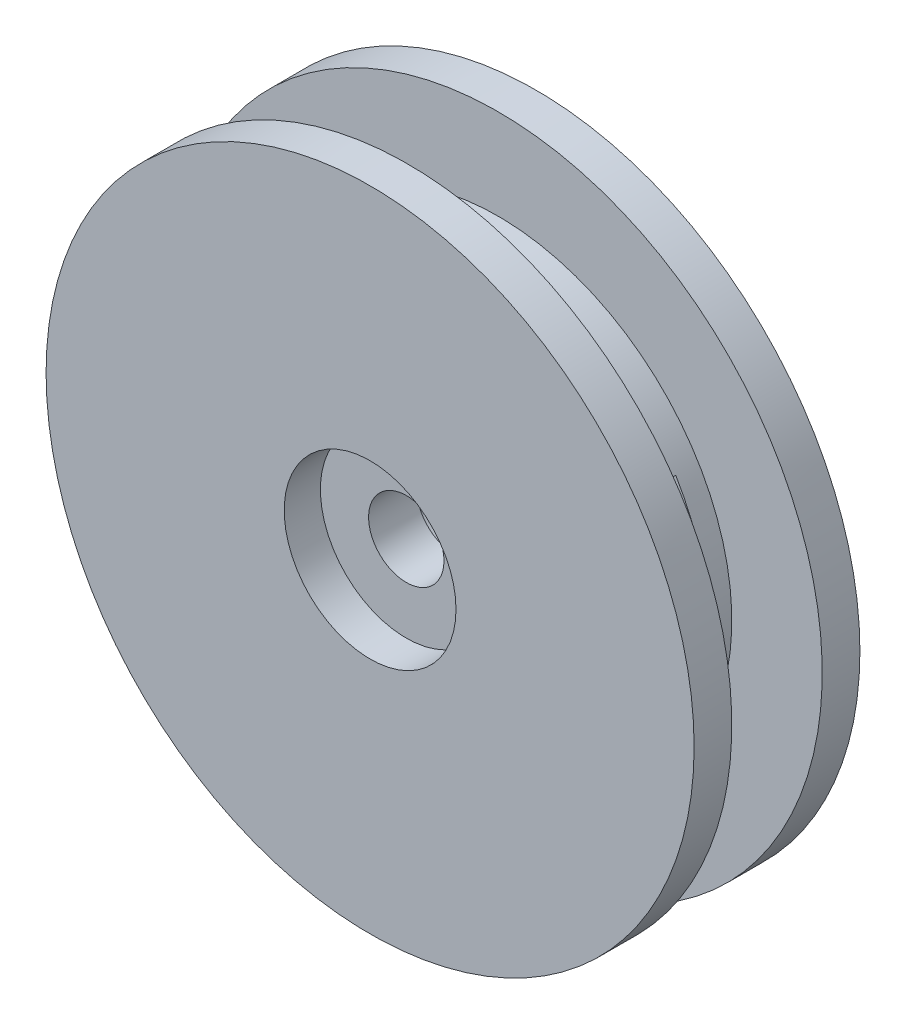
ISO-10303-21;
HEADER;
FILE_DESCRIPTION(('STEP AP214'),'2;1');
FILE_NAME('part.step','',(''),(''),'','','');
FILE_SCHEMA(('AUTOMOTIVE_DESIGN { 1 0 10303 214 1 1 1 1 }'));
ENDSEC;
DATA;
#1=APPLICATION_CONTEXT('core data for automotive mechanical design processes');
#2=APPLICATION_PROTOCOL_DEFINITION('international standard','automotive_design',2000,#1);
#3=PRODUCT_CONTEXT('',#1,'mechanical');
#4=PRODUCT('Part','Part','',(#3));
#5=PRODUCT_RELATED_PRODUCT_CATEGORY('part','',(#4));
#6=PRODUCT_DEFINITION_FORMATION('','',#4);
#7=PRODUCT_DEFINITION_CONTEXT('part definition',#1,'design');
#8=PRODUCT_DEFINITION('design','',#6,#7);
#9=PRODUCT_DEFINITION_SHAPE('','',#8);
#10=(LENGTH_UNIT() NAMED_UNIT(*) SI_UNIT(.MILLI.,.METRE.));
#11=(NAMED_UNIT(*) PLANE_ANGLE_UNIT() SI_UNIT($,.RADIAN.));
#12=(NAMED_UNIT(*) SI_UNIT($,.STERADIAN.) SOLID_ANGLE_UNIT());
#13=UNCERTAINTY_MEASURE_WITH_UNIT(LENGTH_MEASURE(1.E-05),#10,'distance_accuracy_value','');
#14=(GEOMETRIC_REPRESENTATION_CONTEXT(3) GLOBAL_UNCERTAINTY_ASSIGNED_CONTEXT((#13)) GLOBAL_UNIT_ASSIGNED_CONTEXT((#10,
#11,#12)) REPRESENTATION_CONTEXT('',''));
#15=CARTESIAN_POINT('',(0.,0.,0.));
#16=DIRECTION('',(0.,0.,1.));
#17=DIRECTION('',(1.,0.,0.));
#18=AXIS2_PLACEMENT_3D('',#15,#16,#17);
#19=CARTESIAN_POINT('',(0.,0.,0.));
#20=DIRECTION('',(0.,0.,1.));
#21=DIRECTION('',(1.,0.,0.));
#22=AXIS2_PLACEMENT_3D('',#19,#20,#21);
#23=CYLINDRICAL_SURFACE('',#22,1.25);
#24=CARTESIAN_POINT('',(0.,0.,4.3));
#25=DIRECTION('',(0.,0.,1.));
#26=DIRECTION('',(1.,0.,0.));
#27=AXIS2_PLACEMENT_3D('',#24,#25,#26);
#28=CIRCLE('',#27,1.25);
#29=CARTESIAN_POINT('',(1.25,0.,4.3));
#30=VERTEX_POINT('',#29);
#31=EDGE_CURVE('E108',#30,#30,#28,.T.);
#32=ORIENTED_EDGE('',*,*,#31,.T.);
#33=EDGE_LOOP('',(#32));
#34=FACE_BOUND('',#33,.T.);
#35=CARTESIAN_POINT('',(0.,0.,2.7));
#36=DIRECTION('',(0.,0.,-1.));
#37=DIRECTION('',(-1.,0.,0.));
#38=AXIS2_PLACEMENT_3D('',#35,#36,#37);
#39=CIRCLE('',#38,1.25);
#40=CARTESIAN_POINT('',(-1.25,0.,2.7));
#41=VERTEX_POINT('',#40);
#42=EDGE_CURVE('E105',#41,#41,#39,.F.);
#43=ORIENTED_EDGE('',*,*,#42,.F.);
#44=EDGE_LOOP('',(#43));
#45=FACE_BOUND('',#44,.T.);
#46=ADVANCED_FACE('F36',(#34,#45),#23,.F.);
#47=CARTESIAN_POINT('',(0.,0.,5.5));
#48=DIRECTION('',(0.,0.,-1.));
#49=DIRECTION('',(-1.,0.,0.));
#50=AXIS2_PLACEMENT_3D('',#47,#48,#49);
#51=CYLINDRICAL_SURFACE('',#50,10.75);
#52=CARTESIAN_POINT('',(0.,0.,4.25));
#53=DIRECTION('',(0.,0.,-1.));
#54=DIRECTION('',(-1.,0.,0.));
#55=AXIS2_PLACEMENT_3D('',#52,#53,#54);
#56=CIRCLE('',#55,10.75);
#57=CARTESIAN_POINT('',(-10.75,0.,4.25));
#58=VERTEX_POINT('',#57);
#59=EDGE_CURVE('E114',#58,#58,#56,.T.);
#60=ORIENTED_EDGE('',*,*,#59,.F.);
#61=EDGE_LOOP('',(#60));
#62=FACE_BOUND('',#61,.T.);
#63=CARTESIAN_POINT('',(0.,0.,5.5));
#64=DIRECTION('',(0.,0.,1.));
#65=DIRECTION('',(1.,0.,0.));
#66=AXIS2_PLACEMENT_3D('',#63,#64,#65);
#67=CIRCLE('',#66,10.75);
#68=CARTESIAN_POINT('',(10.75,0.,5.5));
#69=VERTEX_POINT('',#68);
#70=EDGE_CURVE('E99',#69,#69,#67,.T.);
#71=ORIENTED_EDGE('',*,*,#70,.F.);
#72=EDGE_LOOP('',(#71));
#73=FACE_BOUND('',#72,.T.);
#74=ADVANCED_FACE('F161',(#62,#73),#51,.T.);
#75=CARTESIAN_POINT('',(0.,0.,5.5));
#76=DIRECTION('',(0.,0.,1.));
#77=DIRECTION('',(1.,0.,0.));
#78=AXIS2_PLACEMENT_3D('',#75,#76,#77);
#79=PLANE('',#78);
#80=CARTESIAN_POINT('',(0.,0.,5.5));
#81=DIRECTION('',(0.,0.,1.));
#82=DIRECTION('',(1.,0.,0.));
#83=AXIS2_PLACEMENT_3D('',#80,#81,#82);
#84=CIRCLE('',#83,2.85);
#85=CARTESIAN_POINT('',(2.85,0.,5.5));
#86=VERTEX_POINT('',#85);
#87=EDGE_CURVE('E112',#86,#86,#84,.T.);
#88=ORIENTED_EDGE('',*,*,#87,.F.);
#89=EDGE_LOOP('',(#88));
#90=FACE_BOUND('',#89,.T.);
#91=ORIENTED_EDGE('',*,*,#70,.T.);
#92=EDGE_LOOP('',(#91));
#93=FACE_BOUND('',#92,.T.);
#94=ADVANCED_FACE('F157',(#90,#93),#79,.T.);
#95=CARTESIAN_POINT('',(0.,10.75,4.25));
#96=DIRECTION('',(0.,0.,1.));
#97=DIRECTION('',(1.,0.,0.));
#98=AXIS2_PLACEMENT_3D('',#95,#96,#97);
#99=PLANE('',#98);
#100=CARTESIAN_POINT('',(0.,0.,4.25));
#101=DIRECTION('',(0.,0.,-1.));
#102=DIRECTION('',(-1.,0.,0.));
#103=AXIS2_PLACEMENT_3D('',#100,#101,#102);
#104=CIRCLE('',#103,7.75);
#105=CARTESIAN_POINT('',(-7.75,0.,4.25));
#106=VERTEX_POINT('',#105);
#107=EDGE_CURVE('E118',#106,#106,#104,.T.);
#108=ORIENTED_EDGE('',*,*,#107,.F.);
#109=EDGE_LOOP('',(#108));
#110=FACE_BOUND('',#109,.T.);
#111=ORIENTED_EDGE('',*,*,#59,.T.);
#112=EDGE_LOOP('',(#111));
#113=FACE_BOUND('',#112,.T.);
#114=ADVANCED_FACE('F149',(#110,#113),#99,.F.);
#115=CARTESIAN_POINT('',(0.,0.,0.));
#116=DIRECTION('',(0.,0.,-1.));
#117=DIRECTION('',(-1.,0.,0.));
#118=AXIS2_PLACEMENT_3D('',#115,#116,#117);
#119=CYLINDRICAL_SURFACE('',#118,7.75);
#120=DIRECTION('',(0.,0.,-1.));
#121=VECTOR('',#120,1.);
#122=CARTESIAN_POINT('',(6.63795902367588,4.,0.));
#123=LINE('',#122,#121);
#124=CARTESIAN_POINT('',(6.63795902367588,4.,3.5));
#125=VERTEX_POINT('',#124);
#126=CARTESIAN_POINT('',(6.63795902367588,4.,2.));
#127=VERTEX_POINT('',#126);
#128=EDGE_CURVE('E76',#125,#127,#123,.T.);
#129=ORIENTED_EDGE('',*,*,#128,.T.);
#130=CARTESIAN_POINT('',(0.,0.,2.));
#131=DIRECTION('',(0.,0.,-1.));
#132=DIRECTION('',(0.,1.,0.));
#133=AXIS2_PLACEMENT_3D('',#130,#131,#132);
#134=CIRCLE('',#133,7.75);
#135=CARTESIAN_POINT('',(7.33570037556061,2.5,2.));
#136=VERTEX_POINT('',#135);
#137=EDGE_CURVE('E11',#127,#136,#134,.T.);
#138=ORIENTED_EDGE('',*,*,#137,.T.);
#139=DIRECTION('',(0.,0.,-1.));
#140=VECTOR('',#139,1.);
#141=CARTESIAN_POINT('',(7.33570037556061,2.5,0.));
#142=LINE('',#141,#140);
#143=CARTESIAN_POINT('',(7.33570037556061,2.5,3.5));
#144=VERTEX_POINT('',#143);
#145=EDGE_CURVE('E40',#136,#144,#142,.F.);
#146=ORIENTED_EDGE('',*,*,#145,.T.);
#147=CARTESIAN_POINT('',(0.,0.,3.5));
#148=DIRECTION('',(0.,0.,1.));
#149=DIRECTION('',(1.,0.,0.));
#150=AXIS2_PLACEMENT_3D('',#147,#148,#149);
#151=CIRCLE('',#150,7.75);
#152=EDGE_CURVE('E80',#144,#125,#151,.T.);
#153=ORIENTED_EDGE('',*,*,#152,.T.);
#154=EDGE_LOOP('',(#129,#138,#146,#153));
#155=FACE_BOUND('',#154,.T.);
#156=DIRECTION('',(0.,0.,-1.));
#157=VECTOR('',#156,1.);
#158=CARTESIAN_POINT('',(-7.33570037556061,2.5,0.));
#159=LINE('',#158,#157);
#160=CARTESIAN_POINT('',(-7.33570037556061,2.5,3.5));
#161=VERTEX_POINT('',#160);
#162=CARTESIAN_POINT('',(-7.33570037556061,2.5,2.));
#163=VERTEX_POINT('',#162);
#164=EDGE_CURVE('E96',#161,#163,#159,.T.);
#165=ORIENTED_EDGE('',*,*,#164,.T.);
#166=CARTESIAN_POINT('',(-6.63795902367588,4.,2.));
#167=VERTEX_POINT('',#166);
#168=EDGE_CURVE('E46',#163,#167,#134,.T.);
#169=ORIENTED_EDGE('',*,*,#168,.T.);
#170=DIRECTION('',(0.,0.,-1.));
#171=VECTOR('',#170,1.);
#172=CARTESIAN_POINT('',(-6.63795902367588,4.,0.));
#173=LINE('',#172,#171);
#174=CARTESIAN_POINT('',(-6.63795902367588,4.,3.5));
#175=VERTEX_POINT('',#174);
#176=EDGE_CURVE('E97',#167,#175,#173,.F.);
#177=ORIENTED_EDGE('',*,*,#176,.T.);
#178=EDGE_CURVE('E86',#175,#161,#151,.T.);
#179=ORIENTED_EDGE('',*,*,#178,.T.);
#180=EDGE_LOOP('',(#165,#169,#177,#179));
#181=FACE_BOUND('',#180,.T.);
#182=CARTESIAN_POINT('',(0.,0.,1.25));
#183=DIRECTION('',(0.,0.,-1.));
#184=DIRECTION('',(-1.,0.,0.));
#185=AXIS2_PLACEMENT_3D('',#182,#183,#184);
#186=CIRCLE('',#185,7.75);
#187=CARTESIAN_POINT('',(-7.75,0.,1.25));
#188=VERTEX_POINT('',#187);
#189=EDGE_CURVE('E121',#188,#188,#186,.T.);
#190=ORIENTED_EDGE('',*,*,#189,.F.);
#191=EDGE_LOOP('',(#190));
#192=FACE_BOUND('',#191,.T.);
#193=ORIENTED_EDGE('',*,*,#107,.T.);
#194=EDGE_LOOP('',(#193));
#195=FACE_BOUND('',#194,.T.);
#196=ADVANCED_FACE('F91',(#155,#181,#192,#195),#119,.T.);
#197=CARTESIAN_POINT('',(0.,7.75,1.25));
#198=DIRECTION('',(0.,0.,-1.));
#199=DIRECTION('',(-1.,0.,0.));
#200=AXIS2_PLACEMENT_3D('',#197,#198,#199);
#201=PLANE('',#200);
#202=CARTESIAN_POINT('',(0.,0.,1.25));
#203=DIRECTION('',(0.,0.,-1.));
#204=DIRECTION('',(-1.,0.,0.));
#205=AXIS2_PLACEMENT_3D('',#202,#203,#204);
#206=CIRCLE('',#205,10.75);
#207=CARTESIAN_POINT('',(-10.75,0.,1.25));
#208=VERTEX_POINT('',#207);
#209=EDGE_CURVE('E124',#208,#208,#206,.T.);
#210=ORIENTED_EDGE('',*,*,#209,.F.);
#211=EDGE_LOOP('',(#210));
#212=FACE_BOUND('',#211,.T.);
#213=ORIENTED_EDGE('',*,*,#189,.T.);
#214=EDGE_LOOP('',(#213));
#215=FACE_BOUND('',#214,.T.);
#216=ADVANCED_FACE('F148',(#212,#215),#201,.F.);
#217=CARTESIAN_POINT('',(0.,0.,0.));
#218=DIRECTION('',(0.,0.,1.));
#219=DIRECTION('',(1.,0.,0.));
#220=AXIS2_PLACEMENT_3D('',#217,#218,#219);
#221=PLANE('',#220);
#222=CARTESIAN_POINT('',(0.,0.,0.));
#223=DIRECTION('',(0.,0.,-1.));
#224=DIRECTION('',(-1.,0.,0.));
#225=AXIS2_PLACEMENT_3D('',#222,#223,#224);
#226=CIRCLE('',#225,2.32);
#227=CARTESIAN_POINT('',(-2.32,0.,0.));
#228=VERTEX_POINT('',#227);
#229=EDGE_CURVE('E132',#228,#228,#226,.T.);
#230=ORIENTED_EDGE('',*,*,#229,.F.);
#231=EDGE_LOOP('',(#230));
#232=FACE_BOUND('',#231,.T.);
#233=CARTESIAN_POINT('',(0.,0.,0.));
#234=DIRECTION('',(0.,0.,1.));
#235=DIRECTION('',(1.,0.,0.));
#236=AXIS2_PLACEMENT_3D('',#233,#234,#235);
#237=CIRCLE('',#236,10.75);
#238=CARTESIAN_POINT('',(10.75,0.,0.));
#239=VERTEX_POINT('',#238);
#240=EDGE_CURVE('E102',#239,#239,#237,.T.);
#241=ORIENTED_EDGE('',*,*,#240,.F.);
#242=EDGE_LOOP('',(#241));
#243=FACE_BOUND('',#242,.T.);
#244=ADVANCED_FACE('F192',(#232,#243),#221,.F.);
#245=ORIENTED_EDGE('',*,*,#209,.T.);
#246=EDGE_LOOP('',(#245));
#247=FACE_BOUND('',#246,.T.);
#248=ORIENTED_EDGE('',*,*,#240,.T.);
#249=EDGE_LOOP('',(#248));
#250=FACE_BOUND('',#249,.T.);
#251=ADVANCED_FACE('F38',(#247,#250),#51,.T.);
#252=CARTESIAN_POINT('',(0.,0.,4.3));
#253=DIRECTION('',(0.,0.,1.));
#254=DIRECTION('',(1.,0.,0.));
#255=AXIS2_PLACEMENT_3D('',#252,#253,#254);
#256=CYLINDRICAL_SURFACE('',#255,2.85);
#257=CARTESIAN_POINT('',(0.,0.,4.3));
#258=DIRECTION('',(0.,0.,1.));
#259=DIRECTION('',(1.,0.,0.));
#260=AXIS2_PLACEMENT_3D('',#257,#258,#259);
#261=CIRCLE('',#260,2.85);
#262=CARTESIAN_POINT('',(2.85,0.,4.3));
#263=VERTEX_POINT('',#262);
#264=EDGE_CURVE('E127',#263,#263,#261,.T.);
#265=ORIENTED_EDGE('',*,*,#264,.F.);
#266=EDGE_LOOP('',(#265));
#267=FACE_BOUND('',#266,.T.);
#268=ORIENTED_EDGE('',*,*,#87,.T.);
#269=EDGE_LOOP('',(#268));
#270=FACE_BOUND('',#269,.T.);
#271=ADVANCED_FACE('F186',(#267,#270),#256,.F.);
#272=CARTESIAN_POINT('',(0.,0.,4.3));
#273=DIRECTION('',(0.,0.,1.));
#274=DIRECTION('',(1.,0.,0.));
#275=AXIS2_PLACEMENT_3D('',#272,#273,#274);
#276=PLANE('',#275);
#277=ORIENTED_EDGE('',*,*,#31,.F.);
#278=EDGE_LOOP('',(#277));
#279=FACE_BOUND('',#278,.T.);
#280=ORIENTED_EDGE('',*,*,#264,.T.);
#281=EDGE_LOOP('',(#280));
#282=FACE_BOUND('',#281,.T.);
#283=ADVANCED_FACE('F182',(#279,#282),#276,.T.);
#284=CARTESIAN_POINT('',(0.,0.,2.7));
#285=DIRECTION('',(0.,0.,-1.));
#286=DIRECTION('',(-1.,0.,0.));
#287=AXIS2_PLACEMENT_3D('',#284,#285,#286);
#288=PLANE('',#287);
#289=CARTESIAN_POINT('',(0.,0.,2.7));
#290=DIRECTION('',(0.,0.,-1.));
#291=DIRECTION('',(-1.,0.,0.));
#292=AXIS2_PLACEMENT_3D('',#289,#290,#291);
#293=CIRCLE('',#292,2.32);
#294=CARTESIAN_POINT('',(-2.32,0.,2.7));
#295=VERTEX_POINT('',#294);
#296=EDGE_CURVE('E109',#295,#295,#293,.T.);
#297=ORIENTED_EDGE('',*,*,#296,.T.);
#298=EDGE_LOOP('',(#297));
#299=FACE_BOUND('',#298,.T.);
#300=ORIENTED_EDGE('',*,*,#42,.T.);
#301=EDGE_LOOP('',(#300));
#302=FACE_BOUND('',#301,.T.);
#303=ADVANCED_FACE('F185',(#299,#302),#288,.T.);
#304=CARTESIAN_POINT('',(0.,0.,2.7));
#305=DIRECTION('',(0.,0.,-1.));
#306=DIRECTION('',(-1.,0.,0.));
#307=AXIS2_PLACEMENT_3D('',#304,#305,#306);
#308=CYLINDRICAL_SURFACE('',#307,2.32);
#309=CARTESIAN_POINT('',(-2.32,0.,2.7));
#310=CARTESIAN_POINT('',(-2.32,0.,2.671875));
#311=CARTESIAN_POINT('',(-2.32,0.,2.64375));
#312=CARTESIAN_POINT('',(-2.32,0.,2.5875));
#313=CARTESIAN_POINT('',(-2.32,0.,2.559375));
#314=CARTESIAN_POINT('',(-2.32,0.,2.503125));
#315=CARTESIAN_POINT('',(-2.32,0.,2.475));
#316=CARTESIAN_POINT('',(-2.32,0.,2.41875));
#317=CARTESIAN_POINT('',(-2.32,0.,2.390625));
#318=CARTESIAN_POINT('',(-2.32,0.,2.334375));
#319=CARTESIAN_POINT('',(-2.32,0.,2.30625));
#320=CARTESIAN_POINT('',(-2.32,0.,2.25));
#321=CARTESIAN_POINT('',(-2.32,0.,2.221875));
#322=CARTESIAN_POINT('',(-2.32,0.,2.165625));
#323=CARTESIAN_POINT('',(-2.32,0.,2.1375));
#324=CARTESIAN_POINT('',(-2.32,0.,2.08125));
#325=CARTESIAN_POINT('',(-2.32,0.,2.053125));
#326=CARTESIAN_POINT('',(-2.32,0.,1.996875));
#327=CARTESIAN_POINT('',(-2.32,0.,1.96875));
#328=CARTESIAN_POINT('',(-2.32,0.,1.9125));
#329=CARTESIAN_POINT('',(-2.32,0.,1.884375));
#330=CARTESIAN_POINT('',(-2.32,0.,1.828125));
#331=CARTESIAN_POINT('',(-2.32,0.,1.8));
#332=CARTESIAN_POINT('',(-2.32,0.,1.74375));
#333=CARTESIAN_POINT('',(-2.32,0.,1.715625));
#334=CARTESIAN_POINT('',(-2.32,0.,1.659375));
#335=CARTESIAN_POINT('',(-2.32,0.,1.63125));
#336=CARTESIAN_POINT('',(-2.32,0.,1.575));
#337=CARTESIAN_POINT('',(-2.32,0.,1.546875));
#338=CARTESIAN_POINT('',(-2.32,0.,1.490625));
#339=CARTESIAN_POINT('',(-2.32,0.,1.4625));
#340=CARTESIAN_POINT('',(-2.32,0.,1.40625));
#341=CARTESIAN_POINT('',(-2.32,0.,1.378125));
#342=CARTESIAN_POINT('',(-2.32,0.,1.321875));
#343=CARTESIAN_POINT('',(-2.32,0.,1.29375));
#344=CARTESIAN_POINT('',(-2.32,0.,1.2375));
#345=CARTESIAN_POINT('',(-2.32,0.,1.209375));
#346=CARTESIAN_POINT('',(-2.32,0.,1.153125));
#347=CARTESIAN_POINT('',(-2.32,0.,1.125));
#348=CARTESIAN_POINT('',(-2.32,0.,1.06875));
#349=CARTESIAN_POINT('',(-2.32,0.,1.040625));
#350=CARTESIAN_POINT('',(-2.32,0.,0.984375));
#351=CARTESIAN_POINT('',(-2.32,0.,0.95625));
#352=CARTESIAN_POINT('',(-2.32,0.,0.9));
#353=CARTESIAN_POINT('',(-2.32,0.,0.871875));
#354=CARTESIAN_POINT('',(-2.32,0.,0.815625));
#355=CARTESIAN_POINT('',(-2.32,0.,0.7875));
#356=CARTESIAN_POINT('',(-2.32,0.,0.73125));
#357=CARTESIAN_POINT('',(-2.32,0.,0.703125000000001));
#358=CARTESIAN_POINT('',(-2.32,0.,0.646875000000001));
#359=CARTESIAN_POINT('',(-2.32,0.,0.61875));
#360=CARTESIAN_POINT('',(-2.32,0.,0.5625));
#361=CARTESIAN_POINT('',(-2.32,0.,0.534375000000001));
#362=CARTESIAN_POINT('',(-2.32,0.,0.478125000000001));
#363=CARTESIAN_POINT('',(-2.32,0.,0.45));
#364=CARTESIAN_POINT('',(-2.32,0.,0.39375));
#365=CARTESIAN_POINT('',(-2.32,0.,0.365625));
#366=CARTESIAN_POINT('',(-2.32,0.,0.309375));
#367=CARTESIAN_POINT('',(-2.32,0.,0.28125));
#368=CARTESIAN_POINT('',(-2.32,0.,0.225));
#369=CARTESIAN_POINT('',(-2.32,0.,0.196875));
#370=CARTESIAN_POINT('',(-2.32,0.,0.140625));
#371=CARTESIAN_POINT('',(-2.32,0.,0.1125));
#372=CARTESIAN_POINT('',(-2.32,0.,0.0562500000000003));
#373=CARTESIAN_POINT('',(-2.32,0.,0.0281250000000003));
#374=CARTESIAN_POINT('',(-2.32,0.,0.));
#375=B_SPLINE_CURVE_WITH_KNOTS('',3,(#309,#310,#311,#312,#313,#314,#315,#316,#317,#318,#319,
#320,#321,#322,#323,#324,#325,#326,#327,#328,#329,#330,#331,#332,#333,#334,#335,#336,#337,#338,
#339,#340,#341,#342,#343,#344,#345,#346,#347,#348,#349,#350,#351,#352,#353,#354,#355,#356,#357,
#358,#359,#360,#361,#362,#363,#364,#365,#366,#367,#368,#369,#370,#371,#372,#373,#374),
.UNSPECIFIED.,.F.,.F.,(4,2,2,2,2,2,2,2,2,2,2,2,2,2,2,2,2,2,2,2,2,2,2,2,2,2,2,2,2,2,2,2,4),(0.,
0.0843750000000003,0.16875,0.253125,0.3375,0.421875,0.50625,0.590625,0.675,0.759375,0.84375,
0.928125,1.0125,1.096875,1.18125,1.265625,1.35,1.434375,1.51875,1.603125,1.6875,1.771875,
1.85625,1.940625,2.025,2.109375,2.19375,2.278125,2.3625,2.446875,2.53125,2.615625,2.7),.UNSPECIFIED.);
#376=EDGE_CURVE('BSEAM180',#295,#228,#375,.T.);
#377=ORIENTED_EDGE('',*,*,#296,.F.);
#378=ORIENTED_EDGE('',*,*,#229,.T.);
#379=ORIENTED_EDGE('',*,*,#376,.T.);
#380=ORIENTED_EDGE('',*,*,#376,.F.);
#381=EDGE_LOOP('',(#377,#379,#378,#380));
#382=FACE_BOUND('',#381,.T.);
#383=ADVANCED_FACE('F180',(#382),#308,.F.);
#384=CARTESIAN_POINT('',(-10.75,2.5,2.));
#385=DIRECTION('',(0.,0.,-1.));
#386=DIRECTION('',(0.,1.,0.));
#387=AXIS2_PLACEMENT_3D('',#384,#385,#386);
#388=PLANE('',#387);
#389=DIRECTION('',(1.,0.,0.));
#390=VECTOR('',#389,1.);
#391=CARTESIAN_POINT('',(-10.75,4.,2.));
#392=LINE('',#391,#390);
#393=EDGE_CURVE('E53',#167,#127,#392,.T.);
#394=ORIENTED_EDGE('',*,*,#393,.F.);
#395=ORIENTED_EDGE('',*,*,#168,.F.);
#396=DIRECTION('',(1.,0.,0.));
#397=VECTOR('',#396,1.);
#398=CARTESIAN_POINT('',(-10.75,2.5,2.));
#399=LINE('',#398,#397);
#400=EDGE_CURVE('E135',#163,#136,#399,.T.);
#401=ORIENTED_EDGE('',*,*,#400,.T.);
#402=ORIENTED_EDGE('',*,*,#137,.F.);
#403=EDGE_LOOP('',(#394,#395,#401,#402));
#404=FACE_BOUND('',#403,.T.);
#405=ADVANCED_FACE('F143',(#404),#388,.F.);
#406=CARTESIAN_POINT('',(-10.75,2.5,3.5));
#407=DIRECTION('',(0.,-1.,0.));
#408=DIRECTION('',(0.,0.,-1.));
#409=AXIS2_PLACEMENT_3D('',#406,#407,#408);
#410=PLANE('',#409);
#411=DIRECTION('',(1.,0.,0.));
#412=VECTOR('',#411,1.);
#413=CARTESIAN_POINT('',(-10.75,2.5,3.5));
#414=LINE('',#413,#412);
#415=EDGE_CURVE('E88',#161,#144,#414,.T.);
#416=ORIENTED_EDGE('',*,*,#415,.T.);
#417=ORIENTED_EDGE('',*,*,#145,.F.);
#418=ORIENTED_EDGE('',*,*,#400,.F.);
#419=ORIENTED_EDGE('',*,*,#164,.F.);
#420=EDGE_LOOP('',(#416,#417,#418,#419));
#421=FACE_BOUND('',#420,.T.);
#422=ADVANCED_FACE('F145',(#421),#410,.F.);
#423=CARTESIAN_POINT('',(-10.75,2.5,3.5));
#424=DIRECTION('',(0.,0.,1.));
#425=DIRECTION('',(1.,0.,0.));
#426=AXIS2_PLACEMENT_3D('',#423,#424,#425);
#427=PLANE('',#426);
#428=ORIENTED_EDGE('',*,*,#415,.F.);
#429=ORIENTED_EDGE('',*,*,#178,.F.);
#430=DIRECTION('',(1.,0.,0.));
#431=VECTOR('',#430,1.);
#432=CARTESIAN_POINT('',(-10.75,4.,3.5));
#433=LINE('',#432,#431);
#434=EDGE_CURVE('E58',#175,#125,#433,.T.);
#435=ORIENTED_EDGE('',*,*,#434,.T.);
#436=ORIENTED_EDGE('',*,*,#152,.F.);
#437=EDGE_LOOP('',(#428,#429,#435,#436));
#438=FACE_BOUND('',#437,.T.);
#439=ADVANCED_FACE('F83',(#438),#427,.F.);
#440=CARTESIAN_POINT('',(-10.75,4.,3.5));
#441=DIRECTION('',(0.,1.,0.));
#442=DIRECTION('',(0.,0.,1.));
#443=AXIS2_PLACEMENT_3D('',#440,#441,#442);
#444=PLANE('',#443);
#445=ORIENTED_EDGE('',*,*,#434,.F.);
#446=ORIENTED_EDGE('',*,*,#176,.F.);
#447=ORIENTED_EDGE('',*,*,#393,.T.);
#448=ORIENTED_EDGE('',*,*,#128,.F.);
#449=EDGE_LOOP('',(#445,#446,#447,#448));
#450=FACE_BOUND('',#449,.T.);
#451=ADVANCED_FACE('F77',(#450),#444,.F.);
#452=CLOSED_SHELL('',(#46,#74,#94,#114,#196,#216,#244,#251,#271,#283,#303,#383,#405,#422,#439,#451));
#453=MANIFOLD_SOLID_BREP('B2',#452);
#454=ADVANCED_BREP_SHAPE_REPRESENTATION('',(#18,#453),#14);
#455=SHAPE_DEFINITION_REPRESENTATION(#9,#454);
ENDSEC;
END-ISO-10303-21;
